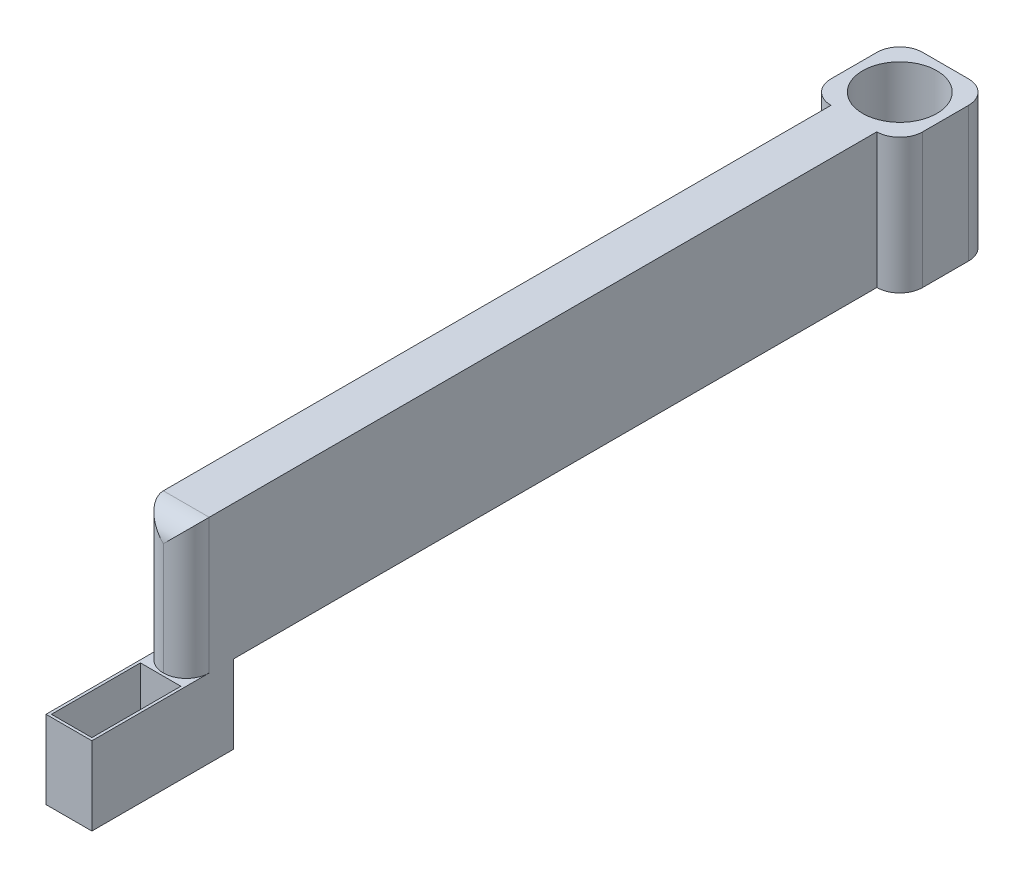
ISO-10303-21;
HEADER;
FILE_DESCRIPTION(('STEP AP214'),'2;1');
FILE_NAME('part.step','',(''),(''),'','','');
FILE_SCHEMA(('AUTOMOTIVE_DESIGN { 1 0 10303 214 1 1 1 1 }'));
ENDSEC;
DATA;
#1=APPLICATION_CONTEXT('core data for automotive mechanical design processes');
#2=APPLICATION_PROTOCOL_DEFINITION('international standard','automotive_design',2000,#1);
#3=PRODUCT_CONTEXT('',#1,'mechanical');
#4=PRODUCT('Part','Part','',(#3));
#5=PRODUCT_RELATED_PRODUCT_CATEGORY('part','',(#4));
#6=PRODUCT_DEFINITION_FORMATION('','',#4);
#7=PRODUCT_DEFINITION_CONTEXT('part definition',#1,'design');
#8=PRODUCT_DEFINITION('design','',#6,#7);
#9=PRODUCT_DEFINITION_SHAPE('','',#8);
#10=(LENGTH_UNIT() NAMED_UNIT(*) SI_UNIT(.MILLI.,.METRE.));
#11=(NAMED_UNIT(*) PLANE_ANGLE_UNIT() SI_UNIT($,.RADIAN.));
#12=(NAMED_UNIT(*) SI_UNIT($,.STERADIAN.) SOLID_ANGLE_UNIT());
#13=UNCERTAINTY_MEASURE_WITH_UNIT(LENGTH_MEASURE(1.E-05),#10,'distance_accuracy_value','');
#14=(GEOMETRIC_REPRESENTATION_CONTEXT(3) GLOBAL_UNCERTAINTY_ASSIGNED_CONTEXT((#13)) GLOBAL_UNIT_ASSIGNED_CONTEXT((#10,
#11,#12)) REPRESENTATION_CONTEXT('',''));
#15=CARTESIAN_POINT('',(0.,0.,0.));
#16=DIRECTION('',(0.,0.,1.));
#17=DIRECTION('',(1.,0.,0.));
#18=AXIS2_PLACEMENT_3D('',#15,#16,#17);
#19=CARTESIAN_POINT('',(0.,0.,0.));
#20=DIRECTION('',(0.,1.,0.));
#21=DIRECTION('',(0.,0.,1.));
#22=AXIS2_PLACEMENT_3D('',#19,#20,#21);
#23=PLANE('',#22);
#24=DIRECTION('',(-1.,0.,0.));
#25=VECTOR('',#24,1.);
#26=CARTESIAN_POINT('',(0.,0.,592.));
#27=LINE('',#26,#25);
#28=CARTESIAN_POINT('',(-24.,0.,592.));
#29=VERTEX_POINT('',#28);
#30=CARTESIAN_POINT('',(-46.,0.,592.));
#31=VERTEX_POINT('',#30);
#32=EDGE_CURVE('E352',#29,#31,#27,.T.);
#33=ORIENTED_EDGE('',*,*,#32,.T.);
#34=DIRECTION('',(0.,0.,1.));
#35=VECTOR('',#34,1.);
#36=CARTESIAN_POINT('',(-46.,0.,0.));
#37=LINE('',#36,#35);
#38=CARTESIAN_POINT('',(-46.,0.,605.));
#39=VERTEX_POINT('',#38);
#40=EDGE_CURVE('E339',#31,#39,#37,.T.);
#41=ORIENTED_EDGE('',*,*,#40,.T.);
#42=DIRECTION('',(1.,0.,0.));
#43=VECTOR('',#42,1.);
#44=CARTESIAN_POINT('',(0.,0.,605.));
#45=LINE('',#44,#43);
#46=CARTESIAN_POINT('',(-24.,0.,605.));
#47=VERTEX_POINT('',#46);
#48=EDGE_CURVE('E358',#39,#47,#45,.T.);
#49=ORIENTED_EDGE('',*,*,#48,.T.);
#50=DIRECTION('',(0.,0.,-1.));
#51=VECTOR('',#50,1.);
#52=CARTESIAN_POINT('',(-24.,0.,0.));
#53=LINE('',#52,#51);
#54=EDGE_CURVE('E355',#47,#29,#53,.T.);
#55=ORIENTED_EDGE('',*,*,#54,.T.);
#56=EDGE_LOOP('',(#33,#41,#49,#55));
#57=FACE_BOUND('',#56,.T.);
#58=DIRECTION('',(0.,0.,1.));
#59=VECTOR('',#58,1.);
#60=CARTESIAN_POINT('',(-51.,0.,0.));
#61=LINE('',#60,#59);
#62=CARTESIAN_POINT('',(-51.,0.,545.));
#63=VERTEX_POINT('',#62);
#64=CARTESIAN_POINT('',(-51.,0.,650.));
#65=VERTEX_POINT('',#64);
#66=EDGE_CURVE('E264',#63,#65,#61,.T.);
#67=ORIENTED_EDGE('',*,*,#66,.F.);
#68=DIRECTION('',(-1.,0.,0.));
#69=VECTOR('',#68,1.);
#70=CARTESIAN_POINT('',(107.,0.,545.));
#71=LINE('',#70,#69);
#72=CARTESIAN_POINT('',(-17.,0.,545.));
#73=VERTEX_POINT('',#72);
#74=EDGE_CURVE('E294',#73,#63,#71,.T.);
#75=ORIENTED_EDGE('',*,*,#74,.F.);
#76=DIRECTION('',(0.,0.,-1.));
#77=VECTOR('',#76,1.);
#78=CARTESIAN_POINT('',(-17.,0.,0.));
#79=LINE('',#78,#77);
#80=CARTESIAN_POINT('',(-17.,0.,650.));
#81=VERTEX_POINT('',#80);
#82=EDGE_CURVE('E257',#81,#73,#79,.T.);
#83=ORIENTED_EDGE('',*,*,#82,.F.);
#84=DIRECTION('',(1.,0.,0.));
#85=VECTOR('',#84,1.);
#86=CARTESIAN_POINT('',(0.,0.,650.));
#87=LINE('',#86,#85);
#88=EDGE_CURVE('E261',#65,#81,#87,.T.);
#89=ORIENTED_EDGE('',*,*,#88,.F.);
#90=EDGE_LOOP('',(#67,#75,#83,#89));
#91=FACE_BOUND('',#90,.T.);
#92=ADVANCED_FACE('F35',(#57,#91),#23,.F.);
#93=CARTESIAN_POINT('',(-51.,158.,0.));
#94=DIRECTION('',(1.,0.,0.));
#95=DIRECTION('',(0.,0.,-1.));
#96=AXIS2_PLACEMENT_3D('',#93,#94,#95);
#97=PLANE('',#96);
#98=DIRECTION('',(0.,0.,1.));
#99=VECTOR('',#98,1.);
#100=CARTESIAN_POINT('',(-51.,58.,0.));
#101=LINE('',#100,#99);
#102=CARTESIAN_POINT('',(-51.,58.,563.));
#103=VERTEX_POINT('',#102);
#104=CARTESIAN_POINT('',(-51.,58.,650.));
#105=VERTEX_POINT('',#104);
#106=EDGE_CURVE('E315',#103,#105,#101,.T.);
#107=ORIENTED_EDGE('',*,*,#106,.F.);
#108=DIRECTION('',(0.,-1.,0.));
#109=VECTOR('',#108,1.);
#110=CARTESIAN_POINT('',(-51.,158.,563.));
#111=LINE('',#110,#109);
#112=CARTESIAN_POINT('',(-51.,158.,563.));
#113=VERTEX_POINT('',#112);
#114=EDGE_CURVE('E213',#103,#113,#111,.F.);
#115=ORIENTED_EDGE('',*,*,#114,.T.);
#116=DIRECTION('',(0.,0.,1.));
#117=VECTOR('',#116,1.);
#118=CARTESIAN_POINT('',(-51.,158.,0.));
#119=LINE('',#118,#117);
#120=CARTESIAN_POINT('',(-51.,158.,68.));
#121=VERTEX_POINT('',#120);
#122=EDGE_CURVE('E260',#121,#113,#119,.T.);
#123=ORIENTED_EDGE('',*,*,#122,.F.);
#124=DIRECTION('',(0.,-1.,0.));
#125=VECTOR('',#124,1.);
#126=CARTESIAN_POINT('',(-51.,158.,68.));
#127=LINE('',#126,#125);
#128=CARTESIAN_POINT('',(-51.,58.,68.));
#129=VERTEX_POINT('',#128);
#130=EDGE_CURVE('E253',#121,#129,#127,.T.);
#131=ORIENTED_EDGE('',*,*,#130,.T.);
#132=DIRECTION('',(0.,0.,-1.));
#133=VECTOR('',#132,1.);
#134=CARTESIAN_POINT('',(-51.,58.,545.));
#135=LINE('',#134,#133);
#136=CARTESIAN_POINT('',(-51.,58.,545.));
#137=VERTEX_POINT('',#136);
#138=EDGE_CURVE('E297',#137,#129,#135,.T.);
#139=ORIENTED_EDGE('',*,*,#138,.F.);
#140=DIRECTION('',(0.,1.,0.));
#141=VECTOR('',#140,1.);
#142=CARTESIAN_POINT('',(-51.,0.,545.));
#143=LINE('',#142,#141);
#144=EDGE_CURVE('E301',#63,#137,#143,.T.);
#145=ORIENTED_EDGE('',*,*,#144,.F.);
#146=ORIENTED_EDGE('',*,*,#66,.T.);
#147=DIRECTION('',(0.,-1.,0.));
#148=VECTOR('',#147,1.);
#149=CARTESIAN_POINT('',(-51.,158.,650.));
#150=LINE('',#149,#148);
#151=EDGE_CURVE('E246',#105,#65,#150,.T.);
#152=ORIENTED_EDGE('',*,*,#151,.F.);
#153=EDGE_LOOP('',(#107,#115,#123,#131,#139,#145,#146,#152));
#154=FACE_BOUND('',#153,.T.);
#155=ADVANCED_FACE('F404',(#154),#97,.F.);
#156=CARTESIAN_POINT('',(0.,158.,650.));
#157=DIRECTION('',(0.,0.,-1.));
#158=DIRECTION('',(-1.,0.,0.));
#159=AXIS2_PLACEMENT_3D('',#156,#157,#158);
#160=PLANE('',#159);
#161=DIRECTION('',(0.,-1.,0.));
#162=VECTOR('',#161,1.);
#163=CARTESIAN_POINT('',(-17.,158.,650.));
#164=LINE('',#163,#162);
#165=CARTESIAN_POINT('',(-17.,58.,650.));
#166=VERTEX_POINT('',#165);
#167=EDGE_CURVE('E248',#166,#81,#164,.T.);
#168=ORIENTED_EDGE('',*,*,#167,.F.);
#169=DIRECTION('',(-1.,0.,0.));
#170=VECTOR('',#169,1.);
#171=CARTESIAN_POINT('',(33.,58.,650.));
#172=LINE('',#171,#170);
#173=EDGE_CURVE('E312',#166,#105,#172,.T.);
#174=ORIENTED_EDGE('',*,*,#173,.T.);
#175=ORIENTED_EDGE('',*,*,#151,.T.);
#176=ORIENTED_EDGE('',*,*,#88,.T.);
#177=EDGE_LOOP('',(#168,#174,#175,#176));
#178=FACE_BOUND('',#177,.T.);
#179=ADVANCED_FACE('F411',(#178),#160,.F.);
#180=CARTESIAN_POINT('',(-17.,158.,0.));
#181=DIRECTION('',(-1.,0.,0.));
#182=DIRECTION('',(0.,0.,1.));
#183=AXIS2_PLACEMENT_3D('',#180,#181,#182);
#184=PLANE('',#183);
#185=DIRECTION('',(0.,0.,-1.));
#186=VECTOR('',#185,1.);
#187=CARTESIAN_POINT('',(-17.,158.,0.));
#188=LINE('',#187,#186);
#189=CARTESIAN_POINT('',(-17.,158.,563.));
#190=VERTEX_POINT('',#189);
#191=CARTESIAN_POINT('',(-17.,158.,68.));
#192=VERTEX_POINT('',#191);
#193=EDGE_CURVE('E276',#190,#192,#188,.T.);
#194=ORIENTED_EDGE('',*,*,#193,.F.);
#195=DIRECTION('',(0.,-1.,0.));
#196=VECTOR('',#195,1.);
#197=CARTESIAN_POINT('',(-17.,158.,563.));
#198=LINE('',#197,#196);
#199=CARTESIAN_POINT('',(-17.,58.,563.));
#200=VERTEX_POINT('',#199);
#201=EDGE_CURVE('E198',#190,#200,#198,.T.);
#202=ORIENTED_EDGE('',*,*,#201,.T.);
#203=DIRECTION('',(0.,0.,1.));
#204=VECTOR('',#203,1.);
#205=CARTESIAN_POINT('',(-17.,58.,0.));
#206=LINE('',#205,#204);
#207=EDGE_CURVE('E215',#200,#166,#206,.T.);
#208=ORIENTED_EDGE('',*,*,#207,.T.);
#209=ORIENTED_EDGE('',*,*,#167,.T.);
#210=ORIENTED_EDGE('',*,*,#82,.T.);
#211=DIRECTION('',(0.,1.,0.));
#212=VECTOR('',#211,1.);
#213=CARTESIAN_POINT('',(-17.,158.,545.));
#214=LINE('',#213,#212);
#215=CARTESIAN_POINT('',(-17.,58.,545.));
#216=VERTEX_POINT('',#215);
#217=EDGE_CURVE('E267',#73,#216,#214,.T.);
#218=ORIENTED_EDGE('',*,*,#217,.T.);
#219=DIRECTION('',(0.,0.,-1.));
#220=VECTOR('',#219,1.);
#221=CARTESIAN_POINT('',(-17.,57.9999999999999,0.));
#222=LINE('',#221,#220);
#223=CARTESIAN_POINT('',(-17.,57.9999999999999,68.));
#224=VERTEX_POINT('',#223);
#225=EDGE_CURVE('E287',#216,#224,#222,.T.);
#226=ORIENTED_EDGE('',*,*,#225,.T.);
#227=DIRECTION('',(0.,-1.,0.));
#228=VECTOR('',#227,1.);
#229=CARTESIAN_POINT('',(-17.,158.,68.));
#230=LINE('',#229,#228);
#231=EDGE_CURVE('E250',#192,#224,#230,.T.);
#232=ORIENTED_EDGE('',*,*,#231,.F.);
#233=EDGE_LOOP('',(#194,#202,#208,#209,#210,#218,#226,#232));
#234=FACE_BOUND('',#233,.T.);
#235=ADVANCED_FACE('F429',(#234),#184,.F.);
#236=CARTESIAN_POINT('',(0.,158.,0.));
#237=DIRECTION('',(1.,0.,0.));
#238=DIRECTION('',(0.,0.,-1.));
#239=AXIS2_PLACEMENT_3D('',#236,#237,#238);
#240=PLANE('',#239);
#241=DIRECTION('',(0.,0.,1.));
#242=VECTOR('',#241,1.);
#243=CARTESIAN_POINT('',(0.,57.9999999999999,0.));
#244=LINE('',#243,#242);
#245=CARTESIAN_POINT('',(0.,57.9999999999999,17.));
#246=VERTEX_POINT('',#245);
#247=CARTESIAN_POINT('',(0.,57.9999999999999,51.));
#248=VERTEX_POINT('',#247);
#249=EDGE_CURVE('E290',#246,#248,#244,.T.);
#250=ORIENTED_EDGE('',*,*,#249,.F.);
#251=DIRECTION('',(0.,-1.,0.));
#252=VECTOR('',#251,1.);
#253=CARTESIAN_POINT('',(0.,158.,17.));
#254=LINE('',#253,#252);
#255=CARTESIAN_POINT('',(0.,158.,17.));
#256=VERTEX_POINT('',#255);
#257=EDGE_CURVE('E236',#246,#256,#254,.F.);
#258=ORIENTED_EDGE('',*,*,#257,.T.);
#259=DIRECTION('',(0.,0.,1.));
#260=VECTOR('',#259,1.);
#261=CARTESIAN_POINT('',(0.,158.,0.));
#262=LINE('',#261,#260);
#263=CARTESIAN_POINT('',(0.,158.,51.));
#264=VERTEX_POINT('',#263);
#265=EDGE_CURVE('E273',#256,#264,#262,.T.);
#266=ORIENTED_EDGE('',*,*,#265,.T.);
#267=DIRECTION('',(0.,-1.,0.));
#268=VECTOR('',#267,1.);
#269=CARTESIAN_POINT('',(0.,158.,51.));
#270=LINE('',#269,#268);
#271=EDGE_CURVE('E238',#264,#248,#270,.T.);
#272=ORIENTED_EDGE('',*,*,#271,.T.);
#273=EDGE_LOOP('',(#250,#258,#266,#272));
#274=FACE_BOUND('',#273,.T.);
#275=ADVANCED_FACE('F425',(#274),#240,.T.);
#276=CARTESIAN_POINT('',(0.,158.,0.));
#277=DIRECTION('',(0.,0.,1.));
#278=DIRECTION('',(1.,0.,0.));
#279=AXIS2_PLACEMENT_3D('',#276,#277,#278);
#280=PLANE('',#279);
#281=DIRECTION('',(0.,-1.,0.));
#282=VECTOR('',#281,1.);
#283=CARTESIAN_POINT('',(-17.,0.,0.));
#284=LINE('',#283,#282);
#285=CARTESIAN_POINT('',(-17.,158.,0.));
#286=VERTEX_POINT('',#285);
#287=CARTESIAN_POINT('',(-17.,57.9999999999999,0.));
#288=VERTEX_POINT('',#287);
#289=EDGE_CURVE('E241',#286,#288,#284,.T.);
#290=ORIENTED_EDGE('',*,*,#289,.T.);
#291=DIRECTION('',(-1.,0.,0.));
#292=VECTOR('',#291,1.);
#293=CARTESIAN_POINT('',(0.,57.9999999999999,0.));
#294=LINE('',#293,#292);
#295=CARTESIAN_POINT('',(-51.,57.9999999999999,0.));
#296=VERTEX_POINT('',#295);
#297=EDGE_CURVE('E282',#288,#296,#294,.T.);
#298=ORIENTED_EDGE('',*,*,#297,.T.);
#299=DIRECTION('',(0.,-1.,0.));
#300=VECTOR('',#299,1.);
#301=CARTESIAN_POINT('',(-51.,158.,0.));
#302=LINE('',#301,#300);
#303=CARTESIAN_POINT('',(-51.,158.,0.));
#304=VERTEX_POINT('',#303);
#305=EDGE_CURVE('E244',#296,#304,#302,.F.);
#306=ORIENTED_EDGE('',*,*,#305,.T.);
#307=DIRECTION('',(-1.,0.,0.));
#308=VECTOR('',#307,1.);
#309=CARTESIAN_POINT('',(0.,158.,0.));
#310=LINE('',#309,#308);
#311=EDGE_CURVE('E270',#286,#304,#310,.T.);
#312=ORIENTED_EDGE('',*,*,#311,.F.);
#313=EDGE_LOOP('',(#290,#298,#306,#312));
#314=FACE_BOUND('',#313,.T.);
#315=ADVANCED_FACE('F421',(#314),#280,.F.);
#316=CARTESIAN_POINT('',(-68.,158.,0.));
#317=DIRECTION('',(1.,0.,0.));
#318=DIRECTION('',(0.,0.,-1.));
#319=AXIS2_PLACEMENT_3D('',#316,#317,#318);
#320=PLANE('',#319);
#321=DIRECTION('',(0.,-1.,0.));
#322=VECTOR('',#321,1.);
#323=CARTESIAN_POINT('',(-68.,158.,17.));
#324=LINE('',#323,#322);
#325=CARTESIAN_POINT('',(-68.,158.,17.));
#326=VERTEX_POINT('',#325);
#327=CARTESIAN_POINT('',(-68.,58.,17.));
#328=VERTEX_POINT('',#327);
#329=EDGE_CURVE('E218',#326,#328,#324,.T.);
#330=ORIENTED_EDGE('',*,*,#329,.T.);
#331=DIRECTION('',(0.,0.,1.));
#332=VECTOR('',#331,1.);
#333=CARTESIAN_POINT('',(-68.,58.,0.));
#334=LINE('',#333,#332);
#335=CARTESIAN_POINT('',(-68.,58.,51.));
#336=VERTEX_POINT('',#335);
#337=EDGE_CURVE('E306',#328,#336,#334,.T.);
#338=ORIENTED_EDGE('',*,*,#337,.T.);
#339=DIRECTION('',(0.,-1.,0.));
#340=VECTOR('',#339,1.);
#341=CARTESIAN_POINT('',(-68.,158.,51.));
#342=LINE('',#341,#340);
#343=CARTESIAN_POINT('',(-68.,158.,51.));
#344=VERTEX_POINT('',#343);
#345=EDGE_CURVE('E226',#336,#344,#342,.F.);
#346=ORIENTED_EDGE('',*,*,#345,.T.);
#347=DIRECTION('',(0.,0.,1.));
#348=VECTOR('',#347,1.);
#349=CARTESIAN_POINT('',(-68.,158.,0.));
#350=LINE('',#349,#348);
#351=EDGE_CURVE('E256',#326,#344,#350,.T.);
#352=ORIENTED_EDGE('',*,*,#351,.F.);
#353=EDGE_LOOP('',(#330,#338,#346,#352));
#354=FACE_BOUND('',#353,.T.);
#355=ADVANCED_FACE('F418',(#354),#320,.F.);
#356=CARTESIAN_POINT('',(0.,158.,0.));
#357=DIRECTION('',(0.,1.,0.));
#358=DIRECTION('',(0.,0.,1.));
#359=AXIS2_PLACEMENT_3D('',#356,#357,#358);
#360=PLANE('',#359);
#361=ORIENTED_EDGE('',*,*,#122,.T.);
#362=DIRECTION('',(-1.,0.,0.));
#363=VECTOR('',#362,1.);
#364=CARTESIAN_POINT('',(-17.,158.,563.));
#365=LINE('',#364,#363);
#366=EDGE_CURVE('E203',#113,#190,#365,.F.);
#367=ORIENTED_EDGE('',*,*,#366,.T.);
#368=ORIENTED_EDGE('',*,*,#193,.T.);
#369=CARTESIAN_POINT('',(-17.,158.,51.));
#370=DIRECTION('',(0.,1.,0.));
#371=DIRECTION('',(0.,0.,1.));
#372=AXIS2_PLACEMENT_3D('',#369,#370,#371);
#373=CIRCLE('',#372,17.);
#374=EDGE_CURVE('E230',#192,#264,#373,.T.);
#375=ORIENTED_EDGE('',*,*,#374,.T.);
#376=ORIENTED_EDGE('',*,*,#265,.F.);
#377=CARTESIAN_POINT('',(-17.,158.,17.));
#378=DIRECTION('',(0.,1.,0.));
#379=DIRECTION('',(0.,0.,1.));
#380=AXIS2_PLACEMENT_3D('',#377,#378,#379);
#381=CIRCLE('',#380,17.);
#382=EDGE_CURVE('E228',#256,#286,#381,.T.);
#383=ORIENTED_EDGE('',*,*,#382,.T.);
#384=ORIENTED_EDGE('',*,*,#311,.T.);
#385=CARTESIAN_POINT('',(-51.,158.,17.));
#386=DIRECTION('',(0.,1.,0.));
#387=DIRECTION('',(0.,0.,1.));
#388=AXIS2_PLACEMENT_3D('',#385,#386,#387);
#389=CIRCLE('',#388,17.);
#390=EDGE_CURVE('E232',#304,#326,#389,.T.);
#391=ORIENTED_EDGE('',*,*,#390,.T.);
#392=ORIENTED_EDGE('',*,*,#351,.T.);
#393=CARTESIAN_POINT('',(-51.,158.,51.));
#394=DIRECTION('',(0.,1.,0.));
#395=DIRECTION('',(0.,0.,1.));
#396=AXIS2_PLACEMENT_3D('',#393,#394,#395);
#397=CIRCLE('',#396,17.);
#398=EDGE_CURVE('E234',#344,#121,#397,.T.);
#399=ORIENTED_EDGE('',*,*,#398,.T.);
#400=EDGE_LOOP('',(#361,#367,#368,#375,#376,#383,#384,#391,#392,#399));
#401=FACE_BOUND('',#400,.T.);
#402=CARTESIAN_POINT('',(-34.,158.,34.));
#403=DIRECTION('',(0.,1.,0.));
#404=DIRECTION('',(0.,0.,1.));
#405=AXIS2_PLACEMENT_3D('',#402,#403,#404);
#406=CIRCLE('',#405,27.5);
#407=CARTESIAN_POINT('',(-34.,158.,61.5));
#408=VERTEX_POINT('',#407);
#409=EDGE_CURVE('E223',#408,#408,#406,.T.);
#410=ORIENTED_EDGE('',*,*,#409,.F.);
#411=EDGE_LOOP('',(#410));
#412=FACE_BOUND('',#411,.T.);
#413=ADVANCED_FACE('F416',(#401,#412),#360,.T.);
#414=CARTESIAN_POINT('',(-17.,158.,17.));
#415=DIRECTION('',(0.,1.,0.));
#416=DIRECTION('',(0.,0.,1.));
#417=AXIS2_PLACEMENT_3D('',#414,#415,#416);
#418=CYLINDRICAL_SURFACE('',#417,17.);
#419=CARTESIAN_POINT('',(-17.,57.9999999999999,17.));
#420=DIRECTION('',(0.,1.,0.));
#421=DIRECTION('',(0.,0.,1.));
#422=AXIS2_PLACEMENT_3D('',#419,#420,#421);
#423=CIRCLE('',#422,17.);
#424=EDGE_CURVE('E285',#288,#246,#423,.F.);
#425=ORIENTED_EDGE('',*,*,#424,.F.);
#426=ORIENTED_EDGE('',*,*,#289,.F.);
#427=ORIENTED_EDGE('',*,*,#382,.F.);
#428=ORIENTED_EDGE('',*,*,#257,.F.);
#429=EDGE_LOOP('',(#425,#426,#427,#428));
#430=FACE_BOUND('',#429,.T.);
#431=ADVANCED_FACE('F437',(#430),#418,.T.);
#432=CARTESIAN_POINT('',(-17.,158.,51.));
#433=DIRECTION('',(0.,-1.,0.));
#434=DIRECTION('',(0.,0.,-1.));
#435=AXIS2_PLACEMENT_3D('',#432,#433,#434);
#436=CYLINDRICAL_SURFACE('',#435,17.);
#437=CARTESIAN_POINT('',(-17.,57.9999999999999,51.));
#438=DIRECTION('',(0.,1.,0.));
#439=DIRECTION('',(0.,0.,1.));
#440=AXIS2_PLACEMENT_3D('',#437,#438,#439);
#441=CIRCLE('',#440,17.);
#442=EDGE_CURVE('E292',#248,#224,#441,.F.);
#443=ORIENTED_EDGE('',*,*,#442,.F.);
#444=ORIENTED_EDGE('',*,*,#271,.F.);
#445=ORIENTED_EDGE('',*,*,#374,.F.);
#446=ORIENTED_EDGE('',*,*,#231,.T.);
#447=EDGE_LOOP('',(#443,#444,#445,#446));
#448=FACE_BOUND('',#447,.T.);
#449=ADVANCED_FACE('F440',(#448),#436,.T.);
#450=CARTESIAN_POINT('',(-51.,158.,17.));
#451=DIRECTION('',(0.,-1.,0.));
#452=DIRECTION('',(0.,0.,-1.));
#453=AXIS2_PLACEMENT_3D('',#450,#451,#452);
#454=CYLINDRICAL_SURFACE('',#453,17.);
#455=CARTESIAN_POINT('',(-51.,58.,17.));
#456=DIRECTION('',(0.,1.,0.));
#457=DIRECTION('',(0.,0.,1.));
#458=AXIS2_PLACEMENT_3D('',#455,#456,#457);
#459=CIRCLE('',#458,17.);
#460=EDGE_CURVE('E304',#328,#296,#459,.F.);
#461=ORIENTED_EDGE('',*,*,#460,.F.);
#462=ORIENTED_EDGE('',*,*,#329,.F.);
#463=ORIENTED_EDGE('',*,*,#390,.F.);
#464=ORIENTED_EDGE('',*,*,#305,.F.);
#465=EDGE_LOOP('',(#461,#462,#463,#464));
#466=FACE_BOUND('',#465,.T.);
#467=ADVANCED_FACE('F444',(#466),#454,.T.);
#468=CARTESIAN_POINT('',(-51.,158.,51.));
#469=DIRECTION('',(0.,1.,0.));
#470=DIRECTION('',(0.,0.,1.));
#471=AXIS2_PLACEMENT_3D('',#468,#469,#470);
#472=CYLINDRICAL_SURFACE('',#471,17.);
#473=CARTESIAN_POINT('',(-51.,58.,51.));
#474=DIRECTION('',(0.,1.,0.));
#475=DIRECTION('',(0.,0.,1.));
#476=AXIS2_PLACEMENT_3D('',#473,#474,#475);
#477=CIRCLE('',#476,17.);
#478=EDGE_CURVE('E222',#129,#336,#477,.F.);
#479=ORIENTED_EDGE('',*,*,#478,.F.);
#480=ORIENTED_EDGE('',*,*,#130,.F.);
#481=ORIENTED_EDGE('',*,*,#398,.F.);
#482=ORIENTED_EDGE('',*,*,#345,.F.);
#483=EDGE_LOOP('',(#479,#480,#481,#482));
#484=FACE_BOUND('',#483,.T.);
#485=ADVANCED_FACE('F448',(#484),#472,.T.);
#486=CARTESIAN_POINT('',(107.,0.,545.));
#487=DIRECTION('',(0.,0.,1.));
#488=DIRECTION('',(1.,0.,0.));
#489=AXIS2_PLACEMENT_3D('',#486,#487,#488);
#490=PLANE('',#489);
#491=ORIENTED_EDGE('',*,*,#74,.T.);
#492=ORIENTED_EDGE('',*,*,#144,.T.);
#493=DIRECTION('',(-1.,0.,0.));
#494=VECTOR('',#493,1.);
#495=CARTESIAN_POINT('',(107.,58.,545.));
#496=LINE('',#495,#494);
#497=EDGE_CURVE('E295',#216,#137,#496,.T.);
#498=ORIENTED_EDGE('',*,*,#497,.F.);
#499=ORIENTED_EDGE('',*,*,#217,.F.);
#500=EDGE_LOOP('',(#491,#492,#498,#499));
#501=FACE_BOUND('',#500,.T.);
#502=ADVANCED_FACE('F452',(#501),#490,.F.);
#503=CARTESIAN_POINT('',(107.,58.,545.));
#504=DIRECTION('',(0.,1.,0.));
#505=DIRECTION('',(0.,0.,1.));
#506=AXIS2_PLACEMENT_3D('',#503,#504,#505);
#507=PLANE('',#506);
#508=CARTESIAN_POINT('',(-34.,57.9999999999999,34.));
#509=DIRECTION('',(0.,1.,0.));
#510=DIRECTION('',(0.,0.,1.));
#511=AXIS2_PLACEMENT_3D('',#508,#509,#510);
#512=CIRCLE('',#511,27.5);
#513=CARTESIAN_POINT('',(-34.,57.9999999999999,61.5));
#514=VERTEX_POINT('',#513);
#515=EDGE_CURVE('E219',#514,#514,#512,.T.);
#516=ORIENTED_EDGE('',*,*,#515,.T.);
#517=EDGE_LOOP('',(#516));
#518=FACE_BOUND('',#517,.T.);
#519=ORIENTED_EDGE('',*,*,#424,.T.);
#520=ORIENTED_EDGE('',*,*,#249,.T.);
#521=ORIENTED_EDGE('',*,*,#442,.T.);
#522=ORIENTED_EDGE('',*,*,#225,.F.);
#523=ORIENTED_EDGE('',*,*,#497,.T.);
#524=ORIENTED_EDGE('',*,*,#138,.T.);
#525=ORIENTED_EDGE('',*,*,#478,.T.);
#526=ORIENTED_EDGE('',*,*,#337,.F.);
#527=ORIENTED_EDGE('',*,*,#460,.T.);
#528=ORIENTED_EDGE('',*,*,#297,.F.);
#529=EDGE_LOOP('',(#519,#520,#521,#522,#523,#524,#525,#526,#527,#528));
#530=FACE_BOUND('',#529,.T.);
#531=ADVANCED_FACE('F491',(#518,#530),#507,.F.);
#532=CARTESIAN_POINT('',(-34.,0.,34.));
#533=DIRECTION('',(0.,1.,0.));
#534=DIRECTION('',(0.,0.,1.));
#535=AXIS2_PLACEMENT_3D('',#532,#533,#534);
#536=CYLINDRICAL_SURFACE('',#535,27.5);
#537=ORIENTED_EDGE('',*,*,#409,.T.);
#538=EDGE_LOOP('',(#537));
#539=FACE_BOUND('',#538,.T.);
#540=ORIENTED_EDGE('',*,*,#515,.F.);
#541=EDGE_LOOP('',(#540));
#542=FACE_BOUND('',#541,.T.);
#543=ADVANCED_FACE('F487',(#539,#542),#536,.F.);
#544=CARTESIAN_POINT('',(33.,58.,0.));
#545=DIRECTION('',(0.,-1.,0.));
#546=DIRECTION('',(0.,0.,-1.));
#547=AXIS2_PLACEMENT_3D('',#544,#545,#546);
#548=PLANE('',#547);
#549=DIRECTION('',(1.,0.,0.));
#550=VECTOR('',#549,1.);
#551=CARTESIAN_POINT('',(-49.,58.,648.));
#552=LINE('',#551,#550);
#553=CARTESIAN_POINT('',(-49.,58.,648.));
#554=VERTEX_POINT('',#553);
#555=CARTESIAN_POINT('',(-19.,58.,648.));
#556=VERTEX_POINT('',#555);
#557=EDGE_CURVE('E334',#554,#556,#552,.T.);
#558=ORIENTED_EDGE('',*,*,#557,.F.);
#559=DIRECTION('',(0.,0.,1.));
#560=VECTOR('',#559,1.);
#561=CARTESIAN_POINT('',(-49.,58.,582.));
#562=LINE('',#561,#560);
#563=CARTESIAN_POINT('',(-49.,58.,582.));
#564=VERTEX_POINT('',#563);
#565=EDGE_CURVE('E337',#564,#554,#562,.T.);
#566=ORIENTED_EDGE('',*,*,#565,.F.);
#567=DIRECTION('',(-1.,0.,0.));
#568=VECTOR('',#567,1.);
#569=CARTESIAN_POINT('',(-49.,58.,582.));
#570=LINE('',#569,#568);
#571=CARTESIAN_POINT('',(-19.,58.,582.));
#572=VERTEX_POINT('',#571);
#573=EDGE_CURVE('E327',#572,#564,#570,.T.);
#574=ORIENTED_EDGE('',*,*,#573,.F.);
#575=DIRECTION('',(0.,0.,-1.));
#576=VECTOR('',#575,1.);
#577=CARTESIAN_POINT('',(-19.,58.,582.));
#578=LINE('',#577,#576);
#579=EDGE_CURVE('E331',#556,#572,#578,.T.);
#580=ORIENTED_EDGE('',*,*,#579,.F.);
#581=EDGE_LOOP('',(#558,#566,#574,#580));
#582=FACE_BOUND('',#581,.T.);
#583=ORIENTED_EDGE('',*,*,#207,.F.);
#584=CARTESIAN_POINT('',(-34.,58.,563.));
#585=DIRECTION('',(0.,-1.,0.));
#586=DIRECTION('',(0.,0.,-1.));
#587=AXIS2_PLACEMENT_3D('',#584,#585,#586);
#588=CIRCLE('',#587,17.);
#589=CARTESIAN_POINT('',(-34.,58.,580.));
#590=VERTEX_POINT('',#589);
#591=EDGE_CURVE('E11',#200,#590,#588,.T.);
#592=ORIENTED_EDGE('',*,*,#591,.T.);
#593=CARTESIAN_POINT('',(-34.,58.,563.));
#594=DIRECTION('',(0.,-1.,0.));
#595=DIRECTION('',(0.,0.,-1.));
#596=AXIS2_PLACEMENT_3D('',#593,#594,#595);
#597=CIRCLE('',#596,17.);
#598=EDGE_CURVE('E45',#590,#103,#597,.T.);
#599=ORIENTED_EDGE('',*,*,#598,.T.);
#600=ORIENTED_EDGE('',*,*,#106,.T.);
#601=ORIENTED_EDGE('',*,*,#173,.F.);
#602=EDGE_LOOP('',(#583,#592,#599,#600,#601));
#603=FACE_BOUND('',#602,.T.);
#604=ADVANCED_FACE('F483',(#582,#603),#548,.F.);
#605=CARTESIAN_POINT('',(-49.,1.99999999999999,582.));
#606=DIRECTION('',(-1.,0.,0.));
#607=DIRECTION('',(0.,0.,1.));
#608=AXIS2_PLACEMENT_3D('',#605,#606,#607);
#609=PLANE('',#608);
#610=ORIENTED_EDGE('',*,*,#565,.T.);
#611=DIRECTION('',(0.,1.,0.));
#612=VECTOR('',#611,1.);
#613=CARTESIAN_POINT('',(-49.,1.99999999999999,648.));
#614=LINE('',#613,#612);
#615=CARTESIAN_POINT('',(-49.,1.99999999999999,648.));
#616=VERTEX_POINT('',#615);
#617=EDGE_CURVE('E318',#616,#554,#614,.T.);
#618=ORIENTED_EDGE('',*,*,#617,.F.);
#619=DIRECTION('',(0.,0.,1.));
#620=VECTOR('',#619,1.);
#621=CARTESIAN_POINT('',(-49.,1.99999999999999,582.));
#622=LINE('',#621,#620);
#623=CARTESIAN_POINT('',(-49.,1.99999999999999,582.));
#624=VERTEX_POINT('',#623);
#625=EDGE_CURVE('E330',#624,#616,#622,.T.);
#626=ORIENTED_EDGE('',*,*,#625,.F.);
#627=DIRECTION('',(0.,1.,0.));
#628=VECTOR('',#627,1.);
#629=CARTESIAN_POINT('',(-49.,1.99999999999999,582.));
#630=LINE('',#629,#628);
#631=EDGE_CURVE('E317',#624,#564,#630,.T.);
#632=ORIENTED_EDGE('',*,*,#631,.T.);
#633=EDGE_LOOP('',(#610,#618,#626,#632));
#634=FACE_BOUND('',#633,.T.);
#635=ADVANCED_FACE('F473',(#634),#609,.F.);
#636=CARTESIAN_POINT('',(-49.,1.99999999999999,582.));
#637=DIRECTION('',(0.,0.,-1.));
#638=DIRECTION('',(0.,1.,0.));
#639=AXIS2_PLACEMENT_3D('',#636,#637,#638);
#640=PLANE('',#639);
#641=ORIENTED_EDGE('',*,*,#573,.T.);
#642=ORIENTED_EDGE('',*,*,#631,.F.);
#643=DIRECTION('',(-1.,0.,0.));
#644=VECTOR('',#643,1.);
#645=CARTESIAN_POINT('',(-49.,1.99999999999999,582.));
#646=LINE('',#645,#644);
#647=CARTESIAN_POINT('',(-19.,1.99999999999999,582.));
#648=VERTEX_POINT('',#647);
#649=EDGE_CURVE('E322',#648,#624,#646,.T.);
#650=ORIENTED_EDGE('',*,*,#649,.F.);
#651=DIRECTION('',(0.,1.,0.));
#652=VECTOR('',#651,1.);
#653=CARTESIAN_POINT('',(-19.,1.99999999999999,582.));
#654=LINE('',#653,#652);
#655=EDGE_CURVE('E324',#648,#572,#654,.T.);
#656=ORIENTED_EDGE('',*,*,#655,.T.);
#657=EDGE_LOOP('',(#641,#642,#650,#656));
#658=FACE_BOUND('',#657,.T.);
#659=ADVANCED_FACE('F469',(#658),#640,.F.);
#660=CARTESIAN_POINT('',(-19.,1.99999999999999,582.));
#661=DIRECTION('',(1.,0.,0.));
#662=DIRECTION('',(0.,0.,-1.));
#663=AXIS2_PLACEMENT_3D('',#660,#661,#662);
#664=PLANE('',#663);
#665=ORIENTED_EDGE('',*,*,#579,.T.);
#666=ORIENTED_EDGE('',*,*,#655,.F.);
#667=DIRECTION('',(0.,0.,-1.));
#668=VECTOR('',#667,1.);
#669=CARTESIAN_POINT('',(-19.,1.99999999999999,582.));
#670=LINE('',#669,#668);
#671=CARTESIAN_POINT('',(-19.,1.99999999999999,648.));
#672=VERTEX_POINT('',#671);
#673=EDGE_CURVE('E342',#672,#648,#670,.T.);
#674=ORIENTED_EDGE('',*,*,#673,.F.);
#675=DIRECTION('',(0.,1.,0.));
#676=VECTOR('',#675,1.);
#677=CARTESIAN_POINT('',(-19.,1.99999999999999,648.));
#678=LINE('',#677,#676);
#679=EDGE_CURVE('E321',#672,#556,#678,.T.);
#680=ORIENTED_EDGE('',*,*,#679,.T.);
#681=EDGE_LOOP('',(#665,#666,#674,#680));
#682=FACE_BOUND('',#681,.T.);
#683=ADVANCED_FACE('F472',(#682),#664,.F.);
#684=CARTESIAN_POINT('',(-49.,1.99999999999999,648.));
#685=DIRECTION('',(0.,0.,1.));
#686=DIRECTION('',(0.,-1.,0.));
#687=AXIS2_PLACEMENT_3D('',#684,#685,#686);
#688=PLANE('',#687);
#689=ORIENTED_EDGE('',*,*,#557,.T.);
#690=ORIENTED_EDGE('',*,*,#679,.F.);
#691=DIRECTION('',(1.,0.,0.));
#692=VECTOR('',#691,1.);
#693=CARTESIAN_POINT('',(-49.,1.99999999999999,648.));
#694=LINE('',#693,#692);
#695=EDGE_CURVE('E345',#616,#672,#694,.T.);
#696=ORIENTED_EDGE('',*,*,#695,.F.);
#697=ORIENTED_EDGE('',*,*,#617,.T.);
#698=EDGE_LOOP('',(#689,#690,#696,#697));
#699=FACE_BOUND('',#698,.T.);
#700=ADVANCED_FACE('F468',(#699),#688,.F.);
#701=CARTESIAN_POINT('',(0.,1.99999999999999,0.));
#702=DIRECTION('',(0.,1.,0.));
#703=DIRECTION('',(0.,0.,1.));
#704=AXIS2_PLACEMENT_3D('',#701,#702,#703);
#705=PLANE('',#704);
#706=DIRECTION('',(0.,0.,1.));
#707=VECTOR('',#706,1.);
#708=CARTESIAN_POINT('',(-46.,1.99999999999999,592.));
#709=LINE('',#708,#707);
#710=CARTESIAN_POINT('',(-46.,1.99999999999999,592.));
#711=VERTEX_POINT('',#710);
#712=CARTESIAN_POINT('',(-46.,1.99999999999999,605.));
#713=VERTEX_POINT('',#712);
#714=EDGE_CURVE('E201',#711,#713,#709,.T.);
#715=ORIENTED_EDGE('',*,*,#714,.F.);
#716=DIRECTION('',(-1.,0.,0.));
#717=VECTOR('',#716,1.);
#718=CARTESIAN_POINT('',(-46.,1.99999999999999,592.));
#719=LINE('',#718,#717);
#720=CARTESIAN_POINT('',(-24.,1.99999999999999,592.));
#721=VERTEX_POINT('',#720);
#722=EDGE_CURVE('E365',#721,#711,#719,.T.);
#723=ORIENTED_EDGE('',*,*,#722,.F.);
#724=DIRECTION('',(0.,0.,-1.));
#725=VECTOR('',#724,1.);
#726=CARTESIAN_POINT('',(-24.,1.99999999999999,592.));
#727=LINE('',#726,#725);
#728=CARTESIAN_POINT('',(-24.,1.99999999999999,605.));
#729=VERTEX_POINT('',#728);
#730=EDGE_CURVE('E372',#729,#721,#727,.T.);
#731=ORIENTED_EDGE('',*,*,#730,.F.);
#732=DIRECTION('',(1.,0.,0.));
#733=VECTOR('',#732,1.);
#734=CARTESIAN_POINT('',(-46.,1.99999999999999,605.));
#735=LINE('',#734,#733);
#736=EDGE_CURVE('E374',#713,#729,#735,.T.);
#737=ORIENTED_EDGE('',*,*,#736,.F.);
#738=EDGE_LOOP('',(#715,#723,#731,#737));
#739=FACE_BOUND('',#738,.T.);
#740=ORIENTED_EDGE('',*,*,#625,.T.);
#741=ORIENTED_EDGE('',*,*,#695,.T.);
#742=ORIENTED_EDGE('',*,*,#673,.T.);
#743=ORIENTED_EDGE('',*,*,#649,.T.);
#744=EDGE_LOOP('',(#740,#741,#742,#743));
#745=FACE_BOUND('',#744,.T.);
#746=ADVANCED_FACE('F387',(#739,#745),#705,.T.);
#747=CARTESIAN_POINT('',(-46.,-54.,592.));
#748=DIRECTION('',(-1.,0.,0.));
#749=DIRECTION('',(0.,0.,1.));
#750=AXIS2_PLACEMENT_3D('',#747,#748,#749);
#751=PLANE('',#750);
#752=DIRECTION('',(0.,1.,0.));
#753=VECTOR('',#752,1.);
#754=CARTESIAN_POINT('',(-46.,-54.,592.));
#755=LINE('',#754,#753);
#756=EDGE_CURVE('E361',#31,#711,#755,.T.);
#757=ORIENTED_EDGE('',*,*,#756,.T.);
#758=ORIENTED_EDGE('',*,*,#714,.T.);
#759=DIRECTION('',(0.,1.,0.));
#760=VECTOR('',#759,1.);
#761=CARTESIAN_POINT('',(-46.,-54.,605.));
#762=LINE('',#761,#760);
#763=EDGE_CURVE('E362',#39,#713,#762,.T.);
#764=ORIENTED_EDGE('',*,*,#763,.F.);
#765=ORIENTED_EDGE('',*,*,#40,.F.);
#766=EDGE_LOOP('',(#757,#758,#764,#765));
#767=FACE_BOUND('',#766,.T.);
#768=ADVANCED_FACE('F379',(#767),#751,.F.);
#769=CARTESIAN_POINT('',(-46.,-54.,592.));
#770=DIRECTION('',(0.,0.,-1.));
#771=DIRECTION('',(-1.,0.,0.));
#772=AXIS2_PLACEMENT_3D('',#769,#770,#771);
#773=PLANE('',#772);
#774=DIRECTION('',(0.,1.,0.));
#775=VECTOR('',#774,1.);
#776=CARTESIAN_POINT('',(-24.,-54.,592.));
#777=LINE('',#776,#775);
#778=EDGE_CURVE('E367',#29,#721,#777,.T.);
#779=ORIENTED_EDGE('',*,*,#778,.T.);
#780=ORIENTED_EDGE('',*,*,#722,.T.);
#781=ORIENTED_EDGE('',*,*,#756,.F.);
#782=ORIENTED_EDGE('',*,*,#32,.F.);
#783=EDGE_LOOP('',(#779,#780,#781,#782));
#784=FACE_BOUND('',#783,.T.);
#785=ADVANCED_FACE('F394',(#784),#773,.F.);
#786=CARTESIAN_POINT('',(-24.,-54.,592.));
#787=DIRECTION('',(1.,0.,0.));
#788=DIRECTION('',(0.,0.,-1.));
#789=AXIS2_PLACEMENT_3D('',#786,#787,#788);
#790=PLANE('',#789);
#791=DIRECTION('',(0.,1.,0.));
#792=VECTOR('',#791,1.);
#793=CARTESIAN_POINT('',(-24.,-54.,605.));
#794=LINE('',#793,#792);
#795=EDGE_CURVE('E186',#47,#729,#794,.T.);
#796=ORIENTED_EDGE('',*,*,#795,.T.);
#797=ORIENTED_EDGE('',*,*,#730,.T.);
#798=ORIENTED_EDGE('',*,*,#778,.F.);
#799=ORIENTED_EDGE('',*,*,#54,.F.);
#800=EDGE_LOOP('',(#796,#797,#798,#799));
#801=FACE_BOUND('',#800,.T.);
#802=ADVANCED_FACE('F390',(#801),#790,.F.);
#803=CARTESIAN_POINT('',(-46.,-54.,605.));
#804=DIRECTION('',(0.,0.,1.));
#805=DIRECTION('',(1.,0.,0.));
#806=AXIS2_PLACEMENT_3D('',#803,#804,#805);
#807=PLANE('',#806);
#808=ORIENTED_EDGE('',*,*,#763,.T.);
#809=ORIENTED_EDGE('',*,*,#736,.T.);
#810=ORIENTED_EDGE('',*,*,#795,.F.);
#811=ORIENTED_EDGE('',*,*,#48,.F.);
#812=EDGE_LOOP('',(#808,#809,#810,#811));
#813=FACE_BOUND('',#812,.T.);
#814=ADVANCED_FACE('F385',(#813),#807,.F.);
#815=CARTESIAN_POINT('',(33.,141.,563.));
#816=DIRECTION('',(1.,0.,0.));
#817=DIRECTION('',(0.,0.,-1.));
#818=AXIS2_PLACEMENT_3D('',#815,#816,#817);
#819=CYLINDRICAL_SURFACE('',#818,17.);
#820=CARTESIAN_POINT('',(-34.,141.,563.));
#821=DIRECTION('',(0.707106781186547,-0.707106781186547,0.));
#822=DIRECTION('',(0.707106781186547,0.707106781186547,0.));
#823=AXIS2_PLACEMENT_3D('',#820,#821,#822);
#824=ELLIPSE('',#823,24.0416305603426,17.);
#825=CARTESIAN_POINT('',(-34.,141.,580.));
#826=VERTEX_POINT('',#825);
#827=EDGE_CURVE('E39',#190,#826,#824,.T.);
#828=ORIENTED_EDGE('',*,*,#827,.F.);
#829=ORIENTED_EDGE('',*,*,#366,.F.);
#830=CARTESIAN_POINT('',(-34.,141.,563.));
#831=DIRECTION('',(0.707106781186547,0.707106781186547,0.));
#832=DIRECTION('',(0.707106781186547,-0.707106781186547,0.));
#833=AXIS2_PLACEMENT_3D('',#830,#831,#832);
#834=ELLIPSE('',#833,24.0416305603426,17.);
#835=EDGE_CURVE('E202',#826,#113,#834,.F.);
#836=ORIENTED_EDGE('',*,*,#835,.F.);
#837=EDGE_LOOP('',(#828,#829,#836));
#838=FACE_BOUND('',#837,.T.);
#839=ADVANCED_FACE('F37',(#838),#819,.T.);
#840=CARTESIAN_POINT('',(-34.,158.,563.));
#841=DIRECTION('',(0.,-1.,0.));
#842=DIRECTION('',(0.,0.,-1.));
#843=AXIS2_PLACEMENT_3D('',#840,#841,#842);
#844=CYLINDRICAL_SURFACE('',#843,17.);
#845=ORIENTED_EDGE('',*,*,#201,.F.);
#846=ORIENTED_EDGE('',*,*,#827,.T.);
#847=DIRECTION('',(0.,-1.,0.));
#848=VECTOR('',#847,1.);
#849=CARTESIAN_POINT('',(-34.,0.,580.));
#850=LINE('',#849,#848);
#851=EDGE_CURVE('E195',#590,#826,#850,.F.);
#852=ORIENTED_EDGE('',*,*,#851,.F.);
#853=ORIENTED_EDGE('',*,*,#591,.F.);
#854=EDGE_LOOP('',(#845,#846,#852,#853));
#855=FACE_BOUND('',#854,.T.);
#856=ADVANCED_FACE('F193',(#855),#844,.T.);
#857=CARTESIAN_POINT('',(-34.,0.,563.));
#858=DIRECTION('',(0.,-1.,0.));
#859=DIRECTION('',(0.,0.,-1.));
#860=AXIS2_PLACEMENT_3D('',#857,#858,#859);
#861=CYLINDRICAL_SURFACE('',#860,17.);
#862=ORIENTED_EDGE('',*,*,#835,.T.);
#863=ORIENTED_EDGE('',*,*,#114,.F.);
#864=ORIENTED_EDGE('',*,*,#598,.F.);
#865=ORIENTED_EDGE('',*,*,#851,.T.);
#866=EDGE_LOOP('',(#862,#863,#864,#865));
#867=FACE_BOUND('',#866,.T.);
#868=ADVANCED_FACE('F207',(#867),#861,.T.);
#869=CLOSED_SHELL('',(#92,#155,#179,#235,#275,#315,#355,#413,#431,#449,#467,#485,#502,#531,#543,
#604,#635,#659,#683,#700,#746,#768,#785,#802,#814,#839,#856,#868));
#870=MANIFOLD_SOLID_BREP('B2',#869);
#871=ADVANCED_BREP_SHAPE_REPRESENTATION('',(#18,#870),#14);
#872=SHAPE_DEFINITION_REPRESENTATION(#9,#871);
ENDSEC;
END-ISO-10303-21;
